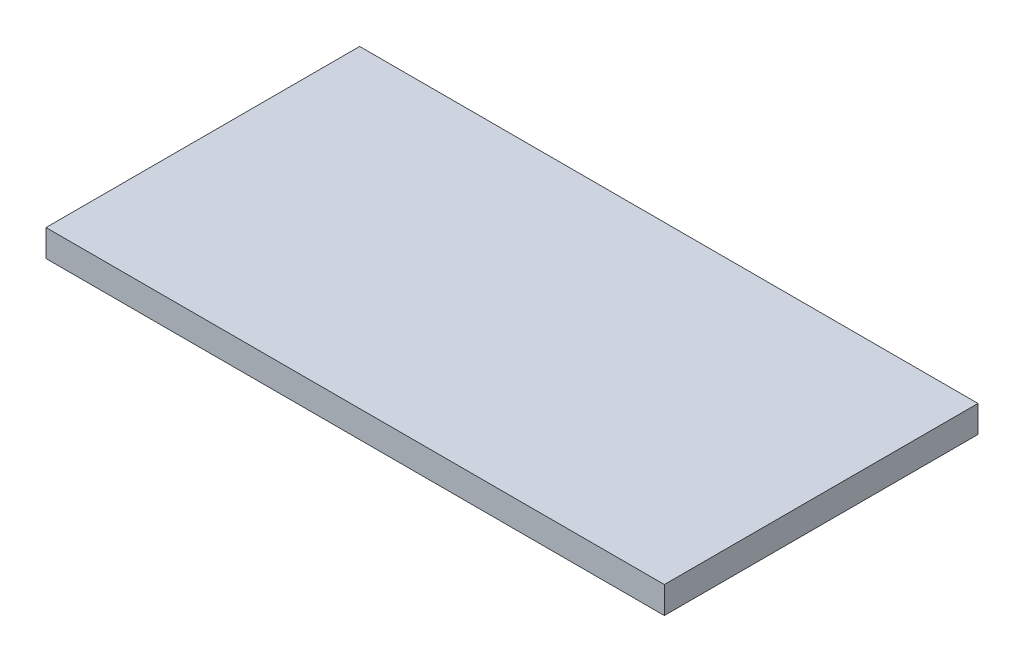
ISO-10303-21;
HEADER;
FILE_DESCRIPTION(('STEP AP214'),'2;1');
FILE_NAME('part.step','',(''),(''),'','','');
FILE_SCHEMA(('AUTOMOTIVE_DESIGN { 1 0 10303 214 1 1 1 1 }'));
ENDSEC;
DATA;
#1=APPLICATION_CONTEXT('core data for automotive mechanical design processes');
#2=APPLICATION_PROTOCOL_DEFINITION('international standard','automotive_design',2000,#1);
#3=PRODUCT_CONTEXT('',#1,'mechanical');
#4=PRODUCT('Part','Part','',(#3));
#5=PRODUCT_RELATED_PRODUCT_CATEGORY('part','',(#4));
#6=PRODUCT_DEFINITION_FORMATION('','',#4);
#7=PRODUCT_DEFINITION_CONTEXT('part definition',#1,'design');
#8=PRODUCT_DEFINITION('design','',#6,#7);
#9=PRODUCT_DEFINITION_SHAPE('','',#8);
#10=(LENGTH_UNIT() NAMED_UNIT(*) SI_UNIT(.MILLI.,.METRE.));
#11=(NAMED_UNIT(*) PLANE_ANGLE_UNIT() SI_UNIT($,.RADIAN.));
#12=(NAMED_UNIT(*) SI_UNIT($,.STERADIAN.) SOLID_ANGLE_UNIT());
#13=UNCERTAINTY_MEASURE_WITH_UNIT(LENGTH_MEASURE(1.E-05),#10,'distance_accuracy_value','');
#14=(GEOMETRIC_REPRESENTATION_CONTEXT(3) GLOBAL_UNCERTAINTY_ASSIGNED_CONTEXT((#13)) GLOBAL_UNIT_ASSIGNED_CONTEXT((#10,
#11,#12)) REPRESENTATION_CONTEXT('',''));
#15=CARTESIAN_POINT('',(0.,0.,0.));
#16=DIRECTION('',(0.,0.,1.));
#17=DIRECTION('',(1.,0.,0.));
#18=AXIS2_PLACEMENT_3D('',#15,#16,#17);
#19=CARTESIAN_POINT('',(34.5,3.,-17.5));
#20=DIRECTION('',(-1.,0.,0.));
#21=DIRECTION('',(0.,0.,1.));
#22=AXIS2_PLACEMENT_3D('',#19,#20,#21);
#23=PLANE('',#22);
#24=DIRECTION('',(0.,0.,-1.));
#25=VECTOR('',#24,1.);
#26=CARTESIAN_POINT('',(34.5,0.,-17.5));
#27=LINE('',#26,#25);
#28=CARTESIAN_POINT('',(34.5,0.,17.5));
#29=VERTEX_POINT('',#28);
#30=CARTESIAN_POINT('',(34.5,0.,-17.5));
#31=VERTEX_POINT('',#30);
#32=EDGE_CURVE('E96',#29,#31,#27,.T.);
#33=ORIENTED_EDGE('',*,*,#32,.T.);
#34=DIRECTION('',(0.,-1.,0.));
#35=VECTOR('',#34,1.);
#36=CARTESIAN_POINT('',(34.5,3.,-17.5));
#37=LINE('',#36,#35);
#38=CARTESIAN_POINT('',(34.5,3.,-17.5));
#39=VERTEX_POINT('',#38);
#40=EDGE_CURVE('E11',#39,#31,#37,.T.);
#41=ORIENTED_EDGE('',*,*,#40,.F.);
#42=DIRECTION('',(0.,0.,-1.));
#43=VECTOR('',#42,1.);
#44=CARTESIAN_POINT('',(34.5,3.,-17.5));
#45=LINE('',#44,#43);
#46=CARTESIAN_POINT('',(34.5,3.,17.5));
#47=VERTEX_POINT('',#46);
#48=EDGE_CURVE('E84',#47,#39,#45,.T.);
#49=ORIENTED_EDGE('',*,*,#48,.F.);
#50=DIRECTION('',(0.,-1.,0.));
#51=VECTOR('',#50,1.);
#52=CARTESIAN_POINT('',(34.5,3.,17.5));
#53=LINE('',#52,#51);
#54=EDGE_CURVE('E92',#47,#29,#53,.T.);
#55=ORIENTED_EDGE('',*,*,#54,.T.);
#56=EDGE_LOOP('',(#33,#41,#49,#55));
#57=FACE_BOUND('',#56,.T.);
#58=ADVANCED_FACE('F33',(#57),#23,.F.);
#59=CARTESIAN_POINT('',(-34.5,3.,-17.5));
#60=DIRECTION('',(0.,0.,1.));
#61=DIRECTION('',(1.,0.,0.));
#62=AXIS2_PLACEMENT_3D('',#59,#60,#61);
#63=PLANE('',#62);
#64=DIRECTION('',(-1.,0.,0.));
#65=VECTOR('',#64,1.);
#66=CARTESIAN_POINT('',(-34.5,0.,-17.5));
#67=LINE('',#66,#65);
#68=CARTESIAN_POINT('',(-34.5,0.,-17.5));
#69=VERTEX_POINT('',#68);
#70=EDGE_CURVE('E88',#31,#69,#67,.T.);
#71=ORIENTED_EDGE('',*,*,#70,.T.);
#72=DIRECTION('',(0.,-1.,0.));
#73=VECTOR('',#72,1.);
#74=CARTESIAN_POINT('',(-34.5,3.,-17.5));
#75=LINE('',#74,#73);
#76=CARTESIAN_POINT('',(-34.5,3.,-17.5));
#77=VERTEX_POINT('',#76);
#78=EDGE_CURVE('E41',#77,#69,#75,.T.);
#79=ORIENTED_EDGE('',*,*,#78,.F.);
#80=DIRECTION('',(-1.,0.,0.));
#81=VECTOR('',#80,1.);
#82=CARTESIAN_POINT('',(-34.5,3.,-17.5));
#83=LINE('',#82,#81);
#84=EDGE_CURVE('E79',#39,#77,#83,.T.);
#85=ORIENTED_EDGE('',*,*,#84,.F.);
#86=ORIENTED_EDGE('',*,*,#40,.T.);
#87=EDGE_LOOP('',(#71,#79,#85,#86));
#88=FACE_BOUND('',#87,.T.);
#89=ADVANCED_FACE('F87',(#88),#63,.F.);
#90=CARTESIAN_POINT('',(-34.5,3.,-17.5));
#91=DIRECTION('',(1.,0.,0.));
#92=DIRECTION('',(0.,0.,-1.));
#93=AXIS2_PLACEMENT_3D('',#90,#91,#92);
#94=PLANE('',#93);
#95=DIRECTION('',(0.,0.,1.));
#96=VECTOR('',#95,1.);
#97=CARTESIAN_POINT('',(-34.5,0.,-17.5));
#98=LINE('',#97,#96);
#99=CARTESIAN_POINT('',(-34.5,0.,17.5));
#100=VERTEX_POINT('',#99);
#101=EDGE_CURVE('E66',#69,#100,#98,.T.);
#102=ORIENTED_EDGE('',*,*,#101,.T.);
#103=DIRECTION('',(0.,-1.,0.));
#104=VECTOR('',#103,1.);
#105=CARTESIAN_POINT('',(-34.5,3.,17.5));
#106=LINE('',#105,#104);
#107=CARTESIAN_POINT('',(-34.5,3.,17.5));
#108=VERTEX_POINT('',#107);
#109=EDGE_CURVE('E89',#108,#100,#106,.T.);
#110=ORIENTED_EDGE('',*,*,#109,.F.);
#111=DIRECTION('',(0.,0.,1.));
#112=VECTOR('',#111,1.);
#113=CARTESIAN_POINT('',(-34.5,3.,-17.5));
#114=LINE('',#113,#112);
#115=EDGE_CURVE('E82',#77,#108,#114,.T.);
#116=ORIENTED_EDGE('',*,*,#115,.F.);
#117=ORIENTED_EDGE('',*,*,#78,.T.);
#118=EDGE_LOOP('',(#102,#110,#116,#117));
#119=FACE_BOUND('',#118,.T.);
#120=ADVANCED_FACE('F90',(#119),#94,.F.);
#121=CARTESIAN_POINT('',(-34.5,3.,17.5));
#122=DIRECTION('',(0.,0.,-1.));
#123=DIRECTION('',(-1.,0.,0.));
#124=AXIS2_PLACEMENT_3D('',#121,#122,#123);
#125=PLANE('',#124);
#126=DIRECTION('',(1.,0.,0.));
#127=VECTOR('',#126,1.);
#128=CARTESIAN_POINT('',(-34.5,0.,17.5));
#129=LINE('',#128,#127);
#130=EDGE_CURVE('E72',#100,#29,#129,.T.);
#131=ORIENTED_EDGE('',*,*,#130,.T.);
#132=ORIENTED_EDGE('',*,*,#54,.F.);
#133=DIRECTION('',(1.,0.,0.));
#134=VECTOR('',#133,1.);
#135=CARTESIAN_POINT('',(-34.5,3.,17.5));
#136=LINE('',#135,#134);
#137=EDGE_CURVE('E49',#108,#47,#136,.T.);
#138=ORIENTED_EDGE('',*,*,#137,.F.);
#139=ORIENTED_EDGE('',*,*,#109,.T.);
#140=EDGE_LOOP('',(#131,#132,#138,#139));
#141=FACE_BOUND('',#140,.T.);
#142=ADVANCED_FACE('F103',(#141),#125,.F.);
#143=CARTESIAN_POINT('',(0.,3.,0.));
#144=DIRECTION('',(0.,1.,0.));
#145=DIRECTION('',(0.,0.,1.));
#146=AXIS2_PLACEMENT_3D('',#143,#144,#145);
#147=PLANE('',#146);
#148=ORIENTED_EDGE('',*,*,#48,.T.);
#149=ORIENTED_EDGE('',*,*,#84,.T.);
#150=ORIENTED_EDGE('',*,*,#115,.T.);
#151=ORIENTED_EDGE('',*,*,#137,.T.);
#152=EDGE_LOOP('',(#148,#149,#150,#151));
#153=FACE_BOUND('',#152,.T.);
#154=ADVANCED_FACE('F80',(#153),#147,.T.);
#155=CARTESIAN_POINT('',(0.,0.,0.));
#156=DIRECTION('',(0.,1.,0.));
#157=DIRECTION('',(0.,0.,1.));
#158=AXIS2_PLACEMENT_3D('',#155,#156,#157);
#159=PLANE('',#158);
#160=ORIENTED_EDGE('',*,*,#32,.F.);
#161=ORIENTED_EDGE('',*,*,#130,.F.);
#162=ORIENTED_EDGE('',*,*,#101,.F.);
#163=ORIENTED_EDGE('',*,*,#70,.F.);
#164=EDGE_LOOP('',(#160,#161,#162,#163));
#165=FACE_BOUND('',#164,.T.);
#166=ADVANCED_FACE('F106',(#165),#159,.F.);
#167=CLOSED_SHELL('',(#58,#89,#120,#142,#154,#166));
#168=MANIFOLD_SOLID_BREP('B2',#167);
#169=ADVANCED_BREP_SHAPE_REPRESENTATION('',(#18,#168),#14);
#170=SHAPE_DEFINITION_REPRESENTATION(#9,#169);
ENDSEC;
END-ISO-10303-21;
